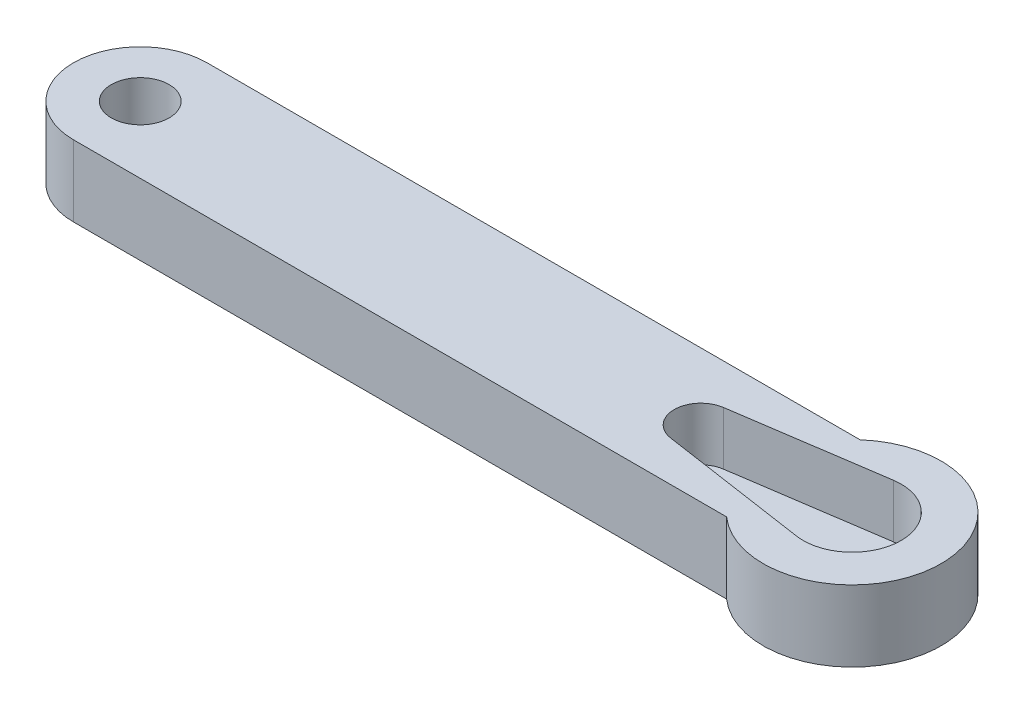
ISO-10303-21;
HEADER;
FILE_DESCRIPTION(('STEP AP214'),'2;1');
FILE_NAME('part.step','',(''),(''),'','','');
FILE_SCHEMA(('AUTOMOTIVE_DESIGN { 1 0 10303 214 1 1 1 1 }'));
ENDSEC;
DATA;
#1=APPLICATION_CONTEXT('core data for automotive mechanical design processes');
#2=APPLICATION_PROTOCOL_DEFINITION('international standard','automotive_design',2000,#1);
#3=PRODUCT_CONTEXT('',#1,'mechanical');
#4=PRODUCT('Part','Part','',(#3));
#5=PRODUCT_RELATED_PRODUCT_CATEGORY('part','',(#4));
#6=PRODUCT_DEFINITION_FORMATION('','',#4);
#7=PRODUCT_DEFINITION_CONTEXT('part definition',#1,'design');
#8=PRODUCT_DEFINITION('design','',#6,#7);
#9=PRODUCT_DEFINITION_SHAPE('','',#8);
#10=(LENGTH_UNIT() NAMED_UNIT(*) SI_UNIT(.MILLI.,.METRE.));
#11=(NAMED_UNIT(*) PLANE_ANGLE_UNIT() SI_UNIT($,.RADIAN.));
#12=(NAMED_UNIT(*) SI_UNIT($,.STERADIAN.) SOLID_ANGLE_UNIT());
#13=UNCERTAINTY_MEASURE_WITH_UNIT(LENGTH_MEASURE(1.E-05),#10,'distance_accuracy_value','');
#14=(GEOMETRIC_REPRESENTATION_CONTEXT(3) GLOBAL_UNCERTAINTY_ASSIGNED_CONTEXT((#13)) GLOBAL_UNIT_ASSIGNED_CONTEXT((#10,
#11,#12)) REPRESENTATION_CONTEXT('',''));
#15=CARTESIAN_POINT('',(0.,0.,0.));
#16=DIRECTION('',(0.,0.,1.));
#17=DIRECTION('',(1.,0.,0.));
#18=AXIS2_PLACEMENT_3D('',#15,#16,#17);
#19=CARTESIAN_POINT('',(2.22256951744566,2.,14.949155238906));
#20=DIRECTION('',(-0.147058823529411,0.,-0.989127748282367));
#21=DIRECTION('',(-0.989127748282367,0.,0.147058823529411));
#22=AXIS2_PLACEMENT_3D('',#19,#20,#21);
#23=PLANE('',#22);
#24=DIRECTION('',(0.989127748282367,0.,-0.147058823529411));
#25=VECTOR('',#24,1.);
#26=CARTESIAN_POINT('',(2.22256951744566,0.,14.949155238906));
#27=LINE('',#26,#25);
#28=CARTESIAN_POINT('',(-25.2961099784474,0.,19.0405020227531));
#29=VERTEX_POINT('',#28);
#30=CARTESIAN_POINT('',(-8.66375703727094,0.,16.5676826520472));
#31=VERTEX_POINT('',#30);
#32=EDGE_CURVE('E113',#29,#31,#27,.T.);
#33=ORIENTED_EDGE('',*,*,#32,.F.);
#34=DIRECTION('',(0.,-1.,0.));
#35=VECTOR('',#34,1.);
#36=CARTESIAN_POINT('',(-25.2961099784474,2.,19.0405020227531));
#37=LINE('',#36,#35);
#38=CARTESIAN_POINT('',(-25.2961099784474,2.,19.0405020227531));
#39=VERTEX_POINT('',#38);
#40=EDGE_CURVE('E12',#39,#29,#37,.T.);
#41=ORIENTED_EDGE('',*,*,#40,.F.);
#42=DIRECTION('',(0.989127748282367,0.,-0.147058823529411));
#43=VECTOR('',#42,1.);
#44=CARTESIAN_POINT('',(2.22256951744566,2.,14.949155238906));
#45=LINE('',#44,#43);
#46=CARTESIAN_POINT('',(-8.66375703727094,2.,16.5676826520472));
#47=VERTEX_POINT('',#46);
#48=EDGE_CURVE('E98',#39,#47,#45,.T.);
#49=ORIENTED_EDGE('',*,*,#48,.T.);
#50=DIRECTION('',(0.,-1.,0.));
#51=VECTOR('',#50,1.);
#52=CARTESIAN_POINT('',(-8.66375703727094,2.,16.5676826520472));
#53=LINE('',#52,#51);
#54=EDGE_CURVE('E86',#47,#31,#53,.T.);
#55=ORIENTED_EDGE('',*,*,#54,.T.);
#56=EDGE_LOOP('',(#33,#41,#49,#55));
#57=FACE_BOUND('',#56,.T.);
#58=ADVANCED_FACE('F47',(#57),#23,.T.);
#59=CARTESIAN_POINT('',(-24.8549335078592,2.,22.0078852676002));
#60=DIRECTION('',(0.,-1.,0.));
#61=DIRECTION('',(0.,0.,-1.));
#62=AXIS2_PLACEMENT_3D('',#59,#60,#61);
#63=CYLINDRICAL_SURFACE('',#62,3.00000000000001);
#64=CARTESIAN_POINT('',(-24.8549335078592,0.,22.0078852676002));
#65=DIRECTION('',(0.,1.,0.));
#66=DIRECTION('',(0.,0.,1.));
#67=AXIS2_PLACEMENT_3D('',#64,#65,#66);
#68=CIRCLE('',#67,3.00000000000001);
#69=CARTESIAN_POINT('',(-25.2961099784474,0.,24.9752685124473));
#70=VERTEX_POINT('',#69);
#71=EDGE_CURVE('E103',#29,#70,#68,.T.);
#72=ORIENTED_EDGE('',*,*,#71,.T.);
#73=DIRECTION('',(0.,-1.,0.));
#74=VECTOR('',#73,1.);
#75=CARTESIAN_POINT('',(-25.2961099784474,2.,24.9752685124473));
#76=LINE('',#75,#74);
#77=CARTESIAN_POINT('',(-25.2961099784474,2.,24.9752685124473));
#78=VERTEX_POINT('',#77);
#79=EDGE_CURVE('E55',#78,#70,#76,.T.);
#80=ORIENTED_EDGE('',*,*,#79,.F.);
#81=CARTESIAN_POINT('',(-24.8549335078592,2.,22.0078852676002));
#82=DIRECTION('',(0.,1.,0.));
#83=DIRECTION('',(0.,0.,1.));
#84=AXIS2_PLACEMENT_3D('',#81,#82,#83);
#85=CIRCLE('',#84,3.00000000000001);
#86=EDGE_CURVE('E92',#39,#78,#85,.T.);
#87=ORIENTED_EDGE('',*,*,#86,.F.);
#88=ORIENTED_EDGE('',*,*,#40,.T.);
#89=EDGE_LOOP('',(#72,#80,#87,#88));
#90=FACE_BOUND('',#89,.T.);
#91=ADVANCED_FACE('F101',(#90),#63,.T.);
#92=CARTESIAN_POINT('',(-4.17996283525962,2.,28.1147171445816));
#93=DIRECTION('',(0.147058823529411,0.,-0.989127748282367));
#94=DIRECTION('',(-0.989127748282367,0.,-0.147058823529411));
#95=AXIS2_PLACEMENT_3D('',#92,#93,#94);
#96=PLANE('',#95);
#97=DIRECTION('',(0.989127748282367,0.,0.147058823529411));
#98=VECTOR('',#97,1.);
#99=CARTESIAN_POINT('',(-4.17996283525962,0.,28.1147171445816));
#100=LINE('',#99,#98);
#101=CARTESIAN_POINT('',(-8.66375703727094,0.,27.4480878831532));
#102=VERTEX_POINT('',#101);
#103=EDGE_CURVE('E79',#70,#102,#100,.T.);
#104=ORIENTED_EDGE('',*,*,#103,.T.);
#105=DIRECTION('',(0.,-1.,0.));
#106=VECTOR('',#105,1.);
#107=CARTESIAN_POINT('',(-8.66375703727094,2.,27.4480878831532));
#108=LINE('',#107,#106);
#109=CARTESIAN_POINT('',(-8.66375703727094,2.,27.4480878831532));
#110=VERTEX_POINT('',#109);
#111=EDGE_CURVE('E104',#110,#102,#108,.T.);
#112=ORIENTED_EDGE('',*,*,#111,.F.);
#113=DIRECTION('',(0.989127748282367,0.,0.147058823529411));
#114=VECTOR('',#113,1.);
#115=CARTESIAN_POINT('',(-4.17996283525962,2.,28.1147171445816));
#116=LINE('',#115,#114);
#117=EDGE_CURVE('E97',#78,#110,#116,.T.);
#118=ORIENTED_EDGE('',*,*,#117,.F.);
#119=ORIENTED_EDGE('',*,*,#79,.T.);
#120=EDGE_LOOP('',(#104,#112,#118,#119));
#121=FACE_BOUND('',#120,.T.);
#122=ADVANCED_FACE('F105',(#121),#96,.F.);
#123=CARTESIAN_POINT('',(-7.85493350785918,2.,22.0078852676002));
#124=DIRECTION('',(0.,-1.,0.));
#125=DIRECTION('',(0.,0.,-1.));
#126=AXIS2_PLACEMENT_3D('',#123,#124,#125);
#127=CYLINDRICAL_SURFACE('',#126,5.5);
#128=CARTESIAN_POINT('',(-7.85493350785918,0.,22.0078852676002));
#129=DIRECTION('',(0.,1.,0.));
#130=DIRECTION('',(0.,0.,1.));
#131=AXIS2_PLACEMENT_3D('',#128,#129,#130);
#132=CIRCLE('',#131,5.5);
#133=EDGE_CURVE('E118',#102,#31,#132,.T.);
#134=ORIENTED_EDGE('',*,*,#133,.T.);
#135=ORIENTED_EDGE('',*,*,#54,.F.);
#136=CARTESIAN_POINT('',(-7.85493350785918,2.,22.0078852676002));
#137=DIRECTION('',(0.,1.,0.));
#138=DIRECTION('',(0.,0.,1.));
#139=AXIS2_PLACEMENT_3D('',#136,#137,#138);
#140=CIRCLE('',#139,5.5);
#141=EDGE_CURVE('E63',#110,#47,#140,.T.);
#142=ORIENTED_EDGE('',*,*,#141,.F.);
#143=ORIENTED_EDGE('',*,*,#111,.T.);
#144=EDGE_LOOP('',(#134,#135,#142,#143));
#145=FACE_BOUND('',#144,.T.);
#146=ADVANCED_FACE('F126',(#145),#127,.T.);
#147=CARTESIAN_POINT('',(-7.85493350785918,2.,22.0078852676002));
#148=DIRECTION('',(0.,-1.,0.));
#149=DIRECTION('',(0.,0.,-1.));
#150=AXIS2_PLACEMENT_3D('',#147,#148,#149);
#151=CYLINDRICAL_SURFACE('',#150,2.4248422272172);
#152=CARTESIAN_POINT('',(-7.85493350785918,2.,22.0078852676002));
#153=DIRECTION('',(0.,1.,0.));
#154=DIRECTION('',(0.,0.,1.));
#155=AXIS2_PLACEMENT_3D('',#152,#153,#154);
#156=CIRCLE('',#155,2.4248422272172);
#157=CARTESIAN_POINT('',(-7.85493350785918,2.,24.4327274948174));
#158=VERTEX_POINT('',#157);
#159=EDGE_CURVE('E107',#158,#158,#156,.T.);
#160=ORIENTED_EDGE('',*,*,#159,.T.);
#161=EDGE_LOOP('',(#160));
#162=FACE_BOUND('',#161,.T.);
#163=CARTESIAN_POINT('',(-7.85493350785918,0.,22.0078852676002));
#164=DIRECTION('',(0.,1.,0.));
#165=DIRECTION('',(0.,0.,1.));
#166=AXIS2_PLACEMENT_3D('',#163,#164,#165);
#167=CIRCLE('',#166,2.4248422272172);
#168=CARTESIAN_POINT('',(-7.85493350785918,0.,24.4327274948174));
#169=VERTEX_POINT('',#168);
#170=EDGE_CURVE('E120',#169,#169,#167,.T.);
#171=ORIENTED_EDGE('',*,*,#170,.F.);
#172=EDGE_LOOP('',(#171));
#173=FACE_BOUND('',#172,.T.);
#174=ADVANCED_FACE('F141',(#162,#173),#151,.F.);
#175=CARTESIAN_POINT('',(0.,2.,0.));
#176=DIRECTION('',(0.,1.,0.));
#177=DIRECTION('',(0.,0.,1.));
#178=AXIS2_PLACEMENT_3D('',#175,#176,#177);
#179=PLANE('',#178);
#180=ORIENTED_EDGE('',*,*,#48,.F.);
#181=ORIENTED_EDGE('',*,*,#86,.T.);
#182=ORIENTED_EDGE('',*,*,#117,.T.);
#183=ORIENTED_EDGE('',*,*,#141,.T.);
#184=EDGE_LOOP('',(#180,#181,#182,#183));
#185=FACE_BOUND('',#184,.T.);
#186=ORIENTED_EDGE('',*,*,#159,.F.);
#187=EDGE_LOOP('',(#186));
#188=FACE_BOUND('',#187,.T.);
#189=ADVANCED_FACE('F94',(#185,#188),#179,.T.);
#190=CARTESIAN_POINT('',(0.,0.,0.));
#191=DIRECTION('',(0.,1.,0.));
#192=DIRECTION('',(0.,0.,1.));
#193=AXIS2_PLACEMENT_3D('',#190,#191,#192);
#194=PLANE('',#193);
#195=ORIENTED_EDGE('',*,*,#32,.T.);
#196=ORIENTED_EDGE('',*,*,#133,.F.);
#197=ORIENTED_EDGE('',*,*,#103,.F.);
#198=ORIENTED_EDGE('',*,*,#71,.F.);
#199=EDGE_LOOP('',(#195,#196,#197,#198));
#200=FACE_BOUND('',#199,.T.);
#201=ORIENTED_EDGE('',*,*,#170,.T.);
#202=EDGE_LOOP('',(#201));
#203=FACE_BOUND('',#202,.T.);
#204=ADVANCED_FACE('F128',(#200,#203),#194,.F.);
#205=CLOSED_SHELL('',(#58,#91,#122,#146,#174,#189,#204));
#206=MANIFOLD_SOLID_BREP('B2',#205);
#207=CARTESIAN_POINT('',(-87.8549335078592,8.,22.0078852676002));
#208=DIRECTION('',(0.,-1.,0.));
#209=DIRECTION('',(0.,0.,-1.));
#210=AXIS2_PLACEMENT_3D('',#207,#208,#209);
#211=CYLINDRICAL_SURFACE('',#210,7.5);
#212=CARTESIAN_POINT('',(-87.8549335078592,0.,22.0078852676002));
#213=DIRECTION('',(0.,1.,0.));
#214=DIRECTION('',(0.,0.,1.));
#215=AXIS2_PLACEMENT_3D('',#212,#213,#214);
#216=CIRCLE('',#215,7.5);
#217=CARTESIAN_POINT('',(-87.8549335078592,0.,14.5078852676002));
#218=VERTEX_POINT('',#217);
#219=CARTESIAN_POINT('',(-87.8549335078592,0.,29.5078852676002));
#220=VERTEX_POINT('',#219);
#221=EDGE_CURVE('E347',#218,#220,#216,.T.);
#222=ORIENTED_EDGE('',*,*,#221,.T.);
#223=DIRECTION('',(0.,-1.,0.));
#224=VECTOR('',#223,1.);
#225=CARTESIAN_POINT('',(-87.8549335078592,8.,29.5078852676002));
#226=LINE('',#225,#224);
#227=CARTESIAN_POINT('',(-87.8549335078592,8.,29.5078852676002));
#228=VERTEX_POINT('',#227);
#229=EDGE_CURVE('E45',#228,#220,#226,.T.);
#230=ORIENTED_EDGE('',*,*,#229,.F.);
#231=CARTESIAN_POINT('',(-87.8549335078592,8.,22.0078852676002));
#232=DIRECTION('',(0.,1.,0.));
#233=DIRECTION('',(0.,0.,1.));
#234=AXIS2_PLACEMENT_3D('',#231,#232,#233);
#235=CIRCLE('',#234,7.5);
#236=CARTESIAN_POINT('',(-87.8549335078592,8.,14.5078852676002));
#237=VERTEX_POINT('',#236);
#238=EDGE_CURVE('E315',#237,#228,#235,.T.);
#239=ORIENTED_EDGE('',*,*,#238,.F.);
#240=DIRECTION('',(0.,-1.,0.));
#241=VECTOR('',#240,1.);
#242=CARTESIAN_POINT('',(-87.8549335078592,8.,14.5078852676002));
#243=LINE('',#242,#241);
#244=EDGE_CURVE('E253',#237,#218,#243,.T.);
#245=ORIENTED_EDGE('',*,*,#244,.T.);
#246=EDGE_LOOP('',(#222,#230,#239,#245));
#247=FACE_BOUND('',#246,.T.);
#248=ADVANCED_FACE('F234',(#247),#211,.T.);
#249=CARTESIAN_POINT('',(0.,8.,29.5078852676002));
#250=DIRECTION('',(0.,0.,-1.));
#251=DIRECTION('',(-1.,0.,0.));
#252=AXIS2_PLACEMENT_3D('',#249,#250,#251);
#253=PLANE('',#252);
#254=DIRECTION('',(1.,0.,0.));
#255=VECTOR('',#254,1.);
#256=CARTESIAN_POINT('',(0.,0.,29.5078852676002));
#257=LINE('',#256,#255);
#258=CARTESIAN_POINT('',(-14.4693117855206,0.,29.5078852676002));
#259=VERTEX_POINT('',#258);
#260=EDGE_CURVE('E321',#220,#259,#257,.T.);
#261=ORIENTED_EDGE('',*,*,#260,.T.);
#262=DIRECTION('',(0.,-1.,0.));
#263=VECTOR('',#262,1.);
#264=CARTESIAN_POINT('',(-14.4693117855206,8.,29.5078852676002));
#265=LINE('',#264,#263);
#266=CARTESIAN_POINT('',(-14.4693117855206,8.,29.5078852676002));
#267=VERTEX_POINT('',#266);
#268=EDGE_CURVE('E244',#267,#259,#265,.T.);
#269=ORIENTED_EDGE('',*,*,#268,.F.);
#270=DIRECTION('',(1.,0.,0.));
#271=VECTOR('',#270,1.);
#272=CARTESIAN_POINT('',(0.,8.,29.5078852676002));
#273=LINE('',#272,#271);
#274=EDGE_CURVE('E309',#228,#267,#273,.T.);
#275=ORIENTED_EDGE('',*,*,#274,.F.);
#276=ORIENTED_EDGE('',*,*,#229,.T.);
#277=EDGE_LOOP('',(#261,#269,#275,#276));
#278=FACE_BOUND('',#277,.T.);
#279=ADVANCED_FACE('F320',(#278),#253,.F.);
#280=CARTESIAN_POINT('',(-7.85493350785918,8.,22.0078852676002));
#281=DIRECTION('',(0.,-1.,0.));
#282=DIRECTION('',(0.,0.,-1.));
#283=AXIS2_PLACEMENT_3D('',#280,#281,#282);
#284=CYLINDRICAL_SURFACE('',#283,9.99999999999999);
#285=CARTESIAN_POINT('',(-7.85493350785918,0.,22.0078852676002));
#286=DIRECTION('',(0.,1.,0.));
#287=DIRECTION('',(0.,0.,1.));
#288=AXIS2_PLACEMENT_3D('',#285,#286,#287);
#289=CIRCLE('',#288,9.99999999999999);
#290=CARTESIAN_POINT('',(-14.4693117855206,0.,14.5078852676002));
#291=VERTEX_POINT('',#290);
#292=EDGE_CURVE('E350',#259,#291,#289,.T.);
#293=ORIENTED_EDGE('',*,*,#292,.T.);
#294=DIRECTION('',(0.,-1.,0.));
#295=VECTOR('',#294,1.);
#296=CARTESIAN_POINT('',(-14.4693117855206,8.,14.5078852676002));
#297=LINE('',#296,#295);
#298=CARTESIAN_POINT('',(-14.4693117855206,8.,14.5078852676002));
#299=VERTEX_POINT('',#298);
#300=EDGE_CURVE('E280',#299,#291,#297,.T.);
#301=ORIENTED_EDGE('',*,*,#300,.F.);
#302=CARTESIAN_POINT('',(-7.85493350785918,8.,22.0078852676002));
#303=DIRECTION('',(0.,1.,0.));
#304=DIRECTION('',(0.,0.,1.));
#305=AXIS2_PLACEMENT_3D('',#302,#303,#304);
#306=CIRCLE('',#305,9.99999999999999);
#307=EDGE_CURVE('E314',#267,#299,#306,.T.);
#308=ORIENTED_EDGE('',*,*,#307,.F.);
#309=ORIENTED_EDGE('',*,*,#268,.T.);
#310=EDGE_LOOP('',(#293,#301,#308,#309));
#311=FACE_BOUND('',#310,.T.);
#312=ADVANCED_FACE('F325',(#311),#284,.T.);
#313=CARTESIAN_POINT('',(2.22256951744566,8.,14.949155238906));
#314=DIRECTION('',(-0.147058823529411,0.,-0.989127748282367));
#315=DIRECTION('',(-0.989127748282367,0.,0.147058823529411));
#316=AXIS2_PLACEMENT_3D('',#313,#314,#315);
#317=PLANE('',#316);
#318=DIRECTION('',(0.989127748282367,0.,-0.147058823529411));
#319=VECTOR('',#318,1.);
#320=CARTESIAN_POINT('',(2.22256951744566,0.,14.949155238906));
#321=LINE('',#320,#319);
#322=CARTESIAN_POINT('',(-25.2961099784474,0.,19.0405020227531));
#323=VERTEX_POINT('',#322);
#324=CARTESIAN_POINT('',(-8.66375703727094,0.,16.5676826520472));
#325=VERTEX_POINT('',#324);
#326=EDGE_CURVE('E332',#323,#325,#321,.T.);
#327=ORIENTED_EDGE('',*,*,#326,.T.);
#328=DIRECTION('',(0.,-1.,0.));
#329=VECTOR('',#328,1.);
#330=CARTESIAN_POINT('',(-8.66375703727094,8.,16.5676826520472));
#331=LINE('',#330,#329);
#332=CARTESIAN_POINT('',(-8.66375703727094,8.,16.5676826520472));
#333=VERTEX_POINT('',#332);
#334=EDGE_CURVE('E238',#333,#325,#331,.T.);
#335=ORIENTED_EDGE('',*,*,#334,.F.);
#336=DIRECTION('',(0.989127748282367,0.,-0.147058823529411));
#337=VECTOR('',#336,1.);
#338=CARTESIAN_POINT('',(2.22256951744566,8.,14.949155238906));
#339=LINE('',#338,#337);
#340=CARTESIAN_POINT('',(-25.2961099784474,8.,19.0405020227531));
#341=VERTEX_POINT('',#340);
#342=EDGE_CURVE('E293',#341,#333,#339,.T.);
#343=ORIENTED_EDGE('',*,*,#342,.F.);
#344=DIRECTION('',(0.,-1.,0.));
#345=VECTOR('',#344,1.);
#346=CARTESIAN_POINT('',(-25.2961099784474,8.,19.0405020227531));
#347=LINE('',#346,#345);
#348=EDGE_CURVE('E328',#341,#323,#347,.T.);
#349=ORIENTED_EDGE('',*,*,#348,.T.);
#350=EDGE_LOOP('',(#327,#335,#343,#349));
#351=FACE_BOUND('',#350,.T.);
#352=ADVANCED_FACE('F236',(#351),#317,.F.);
#353=CARTESIAN_POINT('',(-7.85493350785918,8.,22.0078852676002));
#354=DIRECTION('',(0.,-1.,0.));
#355=DIRECTION('',(0.,0.,-1.));
#356=AXIS2_PLACEMENT_3D('',#353,#354,#355);
#357=CYLINDRICAL_SURFACE('',#356,5.5);
#358=CARTESIAN_POINT('',(-7.85493350785918,0.,22.0078852676002));
#359=DIRECTION('',(0.,1.,0.));
#360=DIRECTION('',(0.,0.,1.));
#361=AXIS2_PLACEMENT_3D('',#358,#359,#360);
#362=CIRCLE('',#361,5.5);
#363=CARTESIAN_POINT('',(-8.66375703727094,0.,27.4480878831532));
#364=VERTEX_POINT('',#363);
#365=EDGE_CURVE('E335',#364,#325,#362,.T.);
#366=ORIENTED_EDGE('',*,*,#365,.F.);
#367=DIRECTION('',(0.,-1.,0.));
#368=VECTOR('',#367,1.);
#369=CARTESIAN_POINT('',(-8.66375703727094,8.,27.4480878831532));
#370=LINE('',#369,#368);
#371=CARTESIAN_POINT('',(-8.66375703727094,8.,27.4480878831532));
#372=VERTEX_POINT('',#371);
#373=EDGE_CURVE('E359',#372,#364,#370,.T.);
#374=ORIENTED_EDGE('',*,*,#373,.F.);
#375=CARTESIAN_POINT('',(-7.85493350785918,8.,22.0078852676002));
#376=DIRECTION('',(0.,1.,0.));
#377=DIRECTION('',(0.,0.,1.));
#378=AXIS2_PLACEMENT_3D('',#375,#376,#377);
#379=CIRCLE('',#378,5.5);
#380=EDGE_CURVE('E367',#372,#333,#379,.T.);
#381=ORIENTED_EDGE('',*,*,#380,.T.);
#382=ORIENTED_EDGE('',*,*,#334,.T.);
#383=EDGE_LOOP('',(#366,#374,#381,#382));
#384=FACE_BOUND('',#383,.T.);
#385=ADVANCED_FACE('F366',(#384),#357,.F.);
#386=CARTESIAN_POINT('',(-4.17996283525962,8.,28.1147171445816));
#387=DIRECTION('',(0.147058823529411,0.,-0.989127748282367));
#388=DIRECTION('',(-0.989127748282367,0.,-0.147058823529411));
#389=AXIS2_PLACEMENT_3D('',#386,#387,#388);
#390=PLANE('',#389);
#391=DIRECTION('',(0.989127748282367,0.,0.147058823529411));
#392=VECTOR('',#391,1.);
#393=CARTESIAN_POINT('',(-4.17996283525962,0.,28.1147171445816));
#394=LINE('',#393,#392);
#395=CARTESIAN_POINT('',(-25.2961099784474,0.,24.9752685124473));
#396=VERTEX_POINT('',#395);
#397=EDGE_CURVE('E338',#396,#364,#394,.T.);
#398=ORIENTED_EDGE('',*,*,#397,.F.);
#399=DIRECTION('',(0.,-1.,0.));
#400=VECTOR('',#399,1.);
#401=CARTESIAN_POINT('',(-25.2961099784474,8.,24.9752685124473));
#402=LINE('',#401,#400);
#403=CARTESIAN_POINT('',(-25.2961099784474,8.,24.9752685124473));
#404=VERTEX_POINT('',#403);
#405=EDGE_CURVE('E358',#404,#396,#402,.T.);
#406=ORIENTED_EDGE('',*,*,#405,.F.);
#407=DIRECTION('',(0.989127748282367,0.,0.147058823529411));
#408=VECTOR('',#407,1.);
#409=CARTESIAN_POINT('',(-4.17996283525962,8.,28.1147171445816));
#410=LINE('',#409,#408);
#411=EDGE_CURVE('E376',#404,#372,#410,.T.);
#412=ORIENTED_EDGE('',*,*,#411,.T.);
#413=ORIENTED_EDGE('',*,*,#373,.T.);
#414=EDGE_LOOP('',(#398,#406,#412,#413));
#415=FACE_BOUND('',#414,.T.);
#416=ADVANCED_FACE('F374',(#415),#390,.T.);
#417=CARTESIAN_POINT('',(-87.8549335078592,8.,22.0078852676002));
#418=DIRECTION('',(0.,-1.,0.));
#419=DIRECTION('',(0.,0.,-1.));
#420=AXIS2_PLACEMENT_3D('',#417,#418,#419);
#421=CYLINDRICAL_SURFACE('',#420,3.24999999999999);
#422=CARTESIAN_POINT('',(-87.8549335078592,8.,22.0078852676002));
#423=DIRECTION('',(0.,1.,0.));
#424=DIRECTION('',(0.,0.,1.));
#425=AXIS2_PLACEMENT_3D('',#422,#423,#424);
#426=CIRCLE('',#425,3.24999999999999);
#427=CARTESIAN_POINT('',(-87.8549335078592,8.,25.2578852676002));
#428=VERTEX_POINT('',#427);
#429=EDGE_CURVE('E383',#428,#428,#426,.T.);
#430=ORIENTED_EDGE('',*,*,#429,.T.);
#431=EDGE_LOOP('',(#430));
#432=FACE_BOUND('',#431,.T.);
#433=CARTESIAN_POINT('',(-87.8549335078592,0.,22.0078852676002));
#434=DIRECTION('',(0.,1.,0.));
#435=DIRECTION('',(0.,0.,1.));
#436=AXIS2_PLACEMENT_3D('',#433,#434,#435);
#437=CIRCLE('',#436,3.24999999999999);
#438=CARTESIAN_POINT('',(-87.8549335078592,0.,25.2578852676002));
#439=VERTEX_POINT('',#438);
#440=EDGE_CURVE('E344',#439,#439,#437,.T.);
#441=ORIENTED_EDGE('',*,*,#440,.F.);
#442=EDGE_LOOP('',(#441));
#443=FACE_BOUND('',#442,.T.);
#444=ADVANCED_FACE('F391',(#432,#443),#421,.F.);
#445=CARTESIAN_POINT('',(-24.8549335078592,8.,22.0078852676002));
#446=DIRECTION('',(0.,-1.,0.));
#447=DIRECTION('',(0.,0.,-1.));
#448=AXIS2_PLACEMENT_3D('',#445,#446,#447);
#449=CYLINDRICAL_SURFACE('',#448,3.00000000000001);
#450=CARTESIAN_POINT('',(-24.8549335078592,0.,22.0078852676002));
#451=DIRECTION('',(0.,1.,0.));
#452=DIRECTION('',(0.,0.,1.));
#453=AXIS2_PLACEMENT_3D('',#450,#451,#452);
#454=CIRCLE('',#453,3.00000000000001);
#455=EDGE_CURVE('E341',#323,#396,#454,.T.);
#456=ORIENTED_EDGE('',*,*,#455,.F.);
#457=ORIENTED_EDGE('',*,*,#348,.F.);
#458=CARTESIAN_POINT('',(-24.8549335078592,8.,22.0078852676002));
#459=DIRECTION('',(0.,1.,0.));
#460=DIRECTION('',(0.,0.,1.));
#461=AXIS2_PLACEMENT_3D('',#458,#459,#460);
#462=CIRCLE('',#461,3.00000000000001);
#463=EDGE_CURVE('E380',#341,#404,#462,.T.);
#464=ORIENTED_EDGE('',*,*,#463,.T.);
#465=ORIENTED_EDGE('',*,*,#405,.T.);
#466=EDGE_LOOP('',(#456,#457,#464,#465));
#467=FACE_BOUND('',#466,.T.);
#468=ADVANCED_FACE('F382',(#467),#449,.F.);
#469=CARTESIAN_POINT('',(0.,8.,14.5078852676002));
#470=DIRECTION('',(0.,0.,-1.));
#471=DIRECTION('',(-1.,0.,0.));
#472=AXIS2_PLACEMENT_3D('',#469,#470,#471);
#473=PLANE('',#472);
#474=DIRECTION('',(1.,0.,0.));
#475=VECTOR('',#474,1.);
#476=CARTESIAN_POINT('',(0.,0.,14.5078852676002));
#477=LINE('',#476,#475);
#478=EDGE_CURVE('E352',#218,#291,#477,.T.);
#479=ORIENTED_EDGE('',*,*,#478,.F.);
#480=ORIENTED_EDGE('',*,*,#244,.F.);
#481=DIRECTION('',(1.,0.,0.));
#482=VECTOR('',#481,1.);
#483=CARTESIAN_POINT('',(0.,8.,14.5078852676002));
#484=LINE('',#483,#482);
#485=EDGE_CURVE('E326',#237,#299,#484,.T.);
#486=ORIENTED_EDGE('',*,*,#485,.T.);
#487=ORIENTED_EDGE('',*,*,#300,.T.);
#488=EDGE_LOOP('',(#479,#480,#486,#487));
#489=FACE_BOUND('',#488,.T.);
#490=ADVANCED_FACE('F394',(#489),#473,.T.);
#491=CARTESIAN_POINT('',(0.,8.,0.));
#492=DIRECTION('',(0.,1.,0.));
#493=DIRECTION('',(0.,0.,1.));
#494=AXIS2_PLACEMENT_3D('',#491,#492,#493);
#495=PLANE('',#494);
#496=ORIENTED_EDGE('',*,*,#342,.T.);
#497=ORIENTED_EDGE('',*,*,#380,.F.);
#498=ORIENTED_EDGE('',*,*,#411,.F.);
#499=ORIENTED_EDGE('',*,*,#463,.F.);
#500=EDGE_LOOP('',(#496,#497,#498,#499));
#501=FACE_BOUND('',#500,.T.);
#502=ORIENTED_EDGE('',*,*,#429,.F.);
#503=EDGE_LOOP('',(#502));
#504=FACE_BOUND('',#503,.T.);
#505=ORIENTED_EDGE('',*,*,#238,.T.);
#506=ORIENTED_EDGE('',*,*,#274,.T.);
#507=ORIENTED_EDGE('',*,*,#307,.T.);
#508=ORIENTED_EDGE('',*,*,#485,.F.);
#509=EDGE_LOOP('',(#505,#506,#507,#508));
#510=FACE_BOUND('',#509,.T.);
#511=ADVANCED_FACE('F311',(#501,#504,#510),#495,.T.);
#512=CARTESIAN_POINT('',(0.,0.,0.));
#513=DIRECTION('',(0.,1.,0.));
#514=DIRECTION('',(0.,0.,1.));
#515=AXIS2_PLACEMENT_3D('',#512,#513,#514);
#516=PLANE('',#515);
#517=ORIENTED_EDGE('',*,*,#326,.F.);
#518=ORIENTED_EDGE('',*,*,#455,.T.);
#519=ORIENTED_EDGE('',*,*,#397,.T.);
#520=ORIENTED_EDGE('',*,*,#365,.T.);
#521=EDGE_LOOP('',(#517,#518,#519,#520));
#522=FACE_BOUND('',#521,.T.);
#523=ORIENTED_EDGE('',*,*,#440,.T.);
#524=EDGE_LOOP('',(#523));
#525=FACE_BOUND('',#524,.T.);
#526=ORIENTED_EDGE('',*,*,#221,.F.);
#527=ORIENTED_EDGE('',*,*,#478,.T.);
#528=ORIENTED_EDGE('',*,*,#292,.F.);
#529=ORIENTED_EDGE('',*,*,#260,.F.);
#530=EDGE_LOOP('',(#526,#527,#528,#529));
#531=FACE_BOUND('',#530,.T.);
#532=ADVANCED_FACE('F372',(#522,#525,#531),#516,.F.);
#533=CLOSED_SHELL('',(#248,#279,#312,#352,#385,#416,#444,#468,#490,#511,#532));
#534=MANIFOLD_SOLID_BREP('B6',#533);
#535=ADVANCED_BREP_SHAPE_REPRESENTATION('',(#18,#206,#534),#14);
#536=SHAPE_DEFINITION_REPRESENTATION(#9,#535);
ENDSEC;
END-ISO-10303-21;
